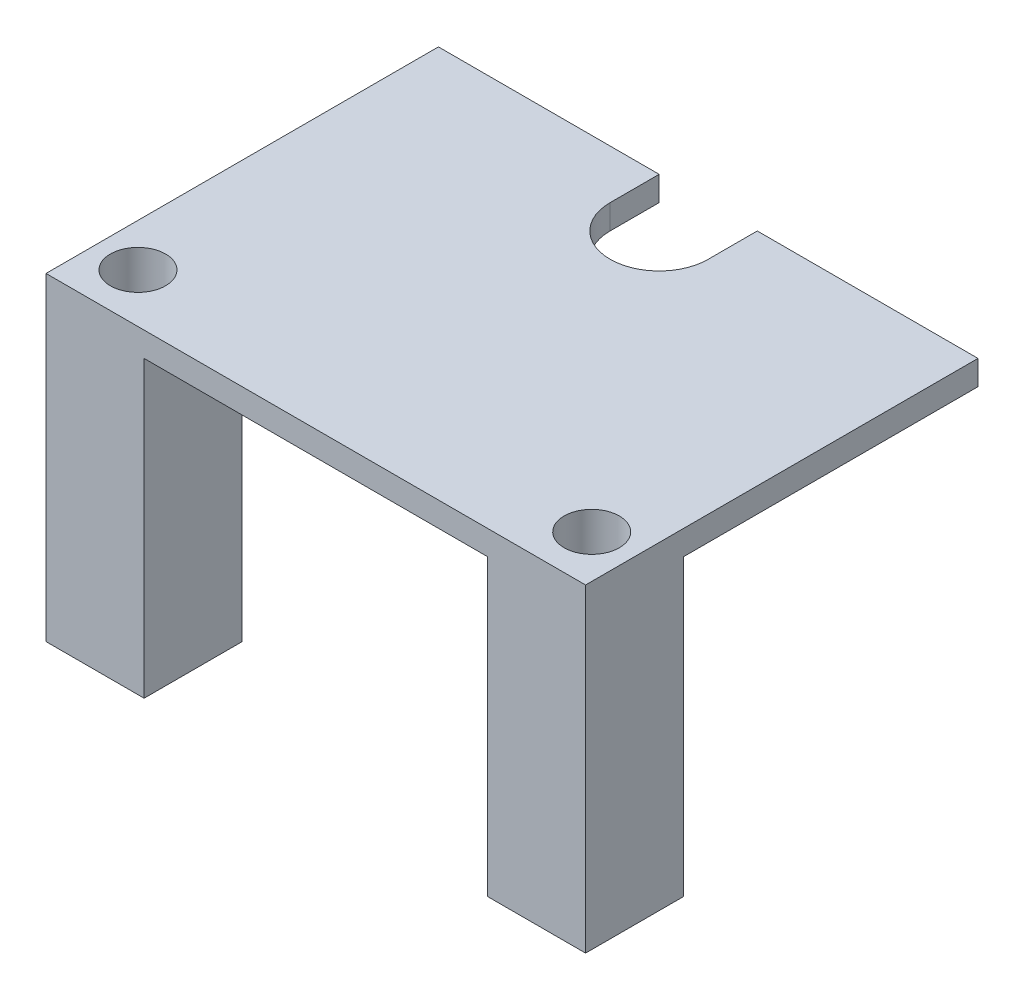
ISO-10303-21;
HEADER;
FILE_DESCRIPTION(('STEP AP214'),'2;1');
FILE_NAME('part.step','',(''),(''),'','','');
FILE_SCHEMA(('AUTOMOTIVE_DESIGN { 1 0 10303 214 1 1 1 1 }'));
ENDSEC;
DATA;
#1=APPLICATION_CONTEXT('core data for automotive mechanical design processes');
#2=APPLICATION_PROTOCOL_DEFINITION('international standard','automotive_design',2000,#1);
#3=PRODUCT_CONTEXT('',#1,'mechanical');
#4=PRODUCT('Part','Part','',(#3));
#5=PRODUCT_RELATED_PRODUCT_CATEGORY('part','',(#4));
#6=PRODUCT_DEFINITION_FORMATION('','',#4);
#7=PRODUCT_DEFINITION_CONTEXT('part definition',#1,'design');
#8=PRODUCT_DEFINITION('design','',#6,#7);
#9=PRODUCT_DEFINITION_SHAPE('','',#8);
#10=(LENGTH_UNIT() NAMED_UNIT(*) SI_UNIT(.MILLI.,.METRE.));
#11=(NAMED_UNIT(*) PLANE_ANGLE_UNIT() SI_UNIT($,.RADIAN.));
#12=(NAMED_UNIT(*) SI_UNIT($,.STERADIAN.) SOLID_ANGLE_UNIT());
#13=UNCERTAINTY_MEASURE_WITH_UNIT(LENGTH_MEASURE(1.E-05),#10,'distance_accuracy_value','');
#14=(GEOMETRIC_REPRESENTATION_CONTEXT(3) GLOBAL_UNCERTAINTY_ASSIGNED_CONTEXT((#13)) GLOBAL_UNIT_ASSIGNED_CONTEXT((#10,
#11,#12)) REPRESENTATION_CONTEXT('',''));
#15=CARTESIAN_POINT('',(0.,0.,0.));
#16=DIRECTION('',(0.,0.,1.));
#17=DIRECTION('',(1.,0.,0.));
#18=AXIS2_PLACEMENT_3D('',#15,#16,#17);
#19=CARTESIAN_POINT('',(69.85,76.2,-88.9));
#20=DIRECTION('',(0.,0.,1.));
#21=DIRECTION('',(1.,0.,0.));
#22=AXIS2_PLACEMENT_3D('',#19,#20,#21);
#23=PLANE('',#22);
#24=DIRECTION('',(-1.,0.,0.));
#25=VECTOR('',#24,1.);
#26=CARTESIAN_POINT('',(69.85,82.55,-88.9));
#27=LINE('',#26,#25);
#28=CARTESIAN_POINT('',(-12.7,82.55,-88.9));
#29=VERTEX_POINT('',#28);
#30=CARTESIAN_POINT('',(-69.85,82.55,-88.9));
#31=VERTEX_POINT('',#30);
#32=EDGE_CURVE('E259',#29,#31,#27,.T.);
#33=ORIENTED_EDGE('',*,*,#32,.F.);
#34=DIRECTION('',(0.,-1.,0.));
#35=VECTOR('',#34,1.);
#36=CARTESIAN_POINT('',(-12.7,76.2,-88.9));
#37=LINE('',#36,#35);
#38=CARTESIAN_POINT('',(-12.7,76.2,-88.9));
#39=VERTEX_POINT('',#38);
#40=EDGE_CURVE('E47',#29,#39,#37,.T.);
#41=ORIENTED_EDGE('',*,*,#40,.T.);
#42=DIRECTION('',(-1.,0.,0.));
#43=VECTOR('',#42,1.);
#44=CARTESIAN_POINT('',(69.85,76.2,-88.9));
#45=LINE('',#44,#43);
#46=CARTESIAN_POINT('',(-69.85,76.2,-88.9));
#47=VERTEX_POINT('',#46);
#48=EDGE_CURVE('E284',#39,#47,#45,.T.);
#49=ORIENTED_EDGE('',*,*,#48,.T.);
#50=DIRECTION('',(0.,1.,0.));
#51=VECTOR('',#50,1.);
#52=CARTESIAN_POINT('',(-69.85,76.2,-88.9));
#53=LINE('',#52,#51);
#54=EDGE_CURVE('E244',#47,#31,#53,.T.);
#55=ORIENTED_EDGE('',*,*,#54,.T.);
#56=EDGE_LOOP('',(#33,#41,#49,#55));
#57=FACE_BOUND('',#56,.T.);
#58=ADVANCED_FACE('F38',(#57),#23,.F.);
#59=CARTESIAN_POINT('',(69.85,0.,12.7));
#60=DIRECTION('',(0.,1.,0.));
#61=DIRECTION('',(0.,0.,1.));
#62=AXIS2_PLACEMENT_3D('',#59,#60,#61);
#63=PLANE('',#62);
#64=CARTESIAN_POINT('',(-58.7375,0.,0.));
#65=DIRECTION('',(0.,1.,0.));
#66=DIRECTION('',(0.,0.,1.));
#67=AXIS2_PLACEMENT_3D('',#64,#65,#66);
#68=CIRCLE('',#67,3.37819999999998);
#69=CARTESIAN_POINT('',(-58.7375,0.,3.37819999999998));
#70=VERTEX_POINT('',#69);
#71=EDGE_CURVE('E202',#70,#70,#68,.T.);
#72=ORIENTED_EDGE('',*,*,#71,.T.);
#73=EDGE_LOOP('',(#72));
#74=FACE_BOUND('',#73,.T.);
#75=DIRECTION('',(-1.,0.,0.));
#76=VECTOR('',#75,1.);
#77=CARTESIAN_POINT('',(69.85,0.,-12.7));
#78=LINE('',#77,#76);
#79=CARTESIAN_POINT('',(-44.45,0.,-12.7));
#80=VERTEX_POINT('',#79);
#81=CARTESIAN_POINT('',(-69.85,0.,-12.7));
#82=VERTEX_POINT('',#81);
#83=EDGE_CURVE('E294',#80,#82,#78,.T.);
#84=ORIENTED_EDGE('',*,*,#83,.F.);
#85=DIRECTION('',(0.,0.,-1.));
#86=VECTOR('',#85,1.);
#87=CARTESIAN_POINT('',(-44.45,0.,12.7));
#88=LINE('',#87,#86);
#89=CARTESIAN_POINT('',(-44.45,0.,12.7));
#90=VERTEX_POINT('',#89);
#91=EDGE_CURVE('E223',#90,#80,#88,.T.);
#92=ORIENTED_EDGE('',*,*,#91,.F.);
#93=DIRECTION('',(-1.,0.,0.));
#94=VECTOR('',#93,1.);
#95=CARTESIAN_POINT('',(69.85,0.,12.7));
#96=LINE('',#95,#94);
#97=CARTESIAN_POINT('',(-69.85,0.,12.7));
#98=VERTEX_POINT('',#97);
#99=EDGE_CURVE('E299',#90,#98,#96,.T.);
#100=ORIENTED_EDGE('',*,*,#99,.T.);
#101=DIRECTION('',(0.,0.,-1.));
#102=VECTOR('',#101,1.);
#103=CARTESIAN_POINT('',(-69.85,0.,12.7));
#104=LINE('',#103,#102);
#105=EDGE_CURVE('E267',#98,#82,#104,.T.);
#106=ORIENTED_EDGE('',*,*,#105,.T.);
#107=EDGE_LOOP('',(#84,#92,#100,#106));
#108=FACE_BOUND('',#107,.T.);
#109=ADVANCED_FACE('F351',(#74,#108),#63,.F.);
#110=CARTESIAN_POINT('',(69.85,0.,-12.7));
#111=DIRECTION('',(0.,0.,1.));
#112=DIRECTION('',(0.,-1.,0.));
#113=AXIS2_PLACEMENT_3D('',#110,#111,#112);
#114=PLANE('',#113);
#115=DIRECTION('',(-1.,0.,0.));
#116=VECTOR('',#115,1.);
#117=CARTESIAN_POINT('',(69.85,76.2,-12.7));
#118=LINE('',#117,#116);
#119=CARTESIAN_POINT('',(-44.45,76.2,-12.7));
#120=VERTEX_POINT('',#119);
#121=CARTESIAN_POINT('',(-69.85,76.2,-12.7));
#122=VERTEX_POINT('',#121);
#123=EDGE_CURVE('E289',#120,#122,#118,.T.);
#124=ORIENTED_EDGE('',*,*,#123,.F.);
#125=DIRECTION('',(0.,-1.,0.));
#126=VECTOR('',#125,1.);
#127=CARTESIAN_POINT('',(-44.45,0.,-12.7));
#128=LINE('',#127,#126);
#129=EDGE_CURVE('E234',#120,#80,#128,.T.);
#130=ORIENTED_EDGE('',*,*,#129,.T.);
#131=ORIENTED_EDGE('',*,*,#83,.T.);
#132=DIRECTION('',(0.,1.,0.));
#133=VECTOR('',#132,1.);
#134=CARTESIAN_POINT('',(-69.85,0.,-12.7));
#135=LINE('',#134,#133);
#136=EDGE_CURVE('E271',#82,#122,#135,.T.);
#137=ORIENTED_EDGE('',*,*,#136,.T.);
#138=EDGE_LOOP('',(#124,#130,#131,#137));
#139=FACE_BOUND('',#138,.T.);
#140=ADVANCED_FACE('F358',(#139),#114,.F.);
#141=CARTESIAN_POINT('',(69.85,82.55,-88.9));
#142=DIRECTION('',(0.,-1.,0.));
#143=DIRECTION('',(0.,0.,-1.));
#144=AXIS2_PLACEMENT_3D('',#141,#142,#143);
#145=PLANE('',#144);
#146=CARTESIAN_POINT('',(58.7375,82.55,0.));
#147=DIRECTION('',(0.,1.,0.));
#148=DIRECTION('',(0.,0.,1.));
#149=AXIS2_PLACEMENT_3D('',#146,#147,#148);
#150=CIRCLE('',#149,7.14374999999999);
#151=CARTESIAN_POINT('',(58.7375,82.55,7.14375000000001));
#152=VERTEX_POINT('',#151);
#153=EDGE_CURVE('E174',#152,#152,#150,.T.);
#154=ORIENTED_EDGE('',*,*,#153,.F.);
#155=EDGE_LOOP('',(#154));
#156=FACE_BOUND('',#155,.T.);
#157=CARTESIAN_POINT('',(-58.7375,82.55,0.));
#158=DIRECTION('',(0.,1.,0.));
#159=DIRECTION('',(0.,0.,1.));
#160=AXIS2_PLACEMENT_3D('',#157,#158,#159);
#161=CIRCLE('',#160,7.14374999999999);
#162=CARTESIAN_POINT('',(-58.7375,82.55,7.14375000000002));
#163=VERTEX_POINT('',#162);
#164=EDGE_CURVE('E190',#163,#163,#161,.T.);
#165=ORIENTED_EDGE('',*,*,#164,.F.);
#166=EDGE_LOOP('',(#165));
#167=FACE_BOUND('',#166,.T.);
#168=CARTESIAN_POINT('',(0.,82.55,-76.2));
#169=DIRECTION('',(0.,1.,0.));
#170=DIRECTION('',(0.,0.,-1.));
#171=AXIS2_PLACEMENT_3D('',#168,#169,#170);
#172=CIRCLE('',#171,12.7);
#173=CARTESIAN_POINT('',(-12.7,82.55,-76.2));
#174=VERTEX_POINT('',#173);
#175=CARTESIAN_POINT('',(12.7,82.55,-76.2));
#176=VERTEX_POINT('',#175);
#177=EDGE_CURVE('E149',#174,#176,#172,.T.);
#178=ORIENTED_EDGE('',*,*,#177,.F.);
#179=DIRECTION('',(0.,0.,1.));
#180=VECTOR('',#179,1.);
#181=CARTESIAN_POINT('',(-12.7,82.55,-76.2));
#182=LINE('',#181,#180);
#183=EDGE_CURVE('E146',#29,#174,#182,.T.);
#184=ORIENTED_EDGE('',*,*,#183,.F.);
#185=ORIENTED_EDGE('',*,*,#32,.T.);
#186=DIRECTION('',(0.,0.,1.));
#187=VECTOR('',#186,1.);
#188=CARTESIAN_POINT('',(-69.85,82.55,-88.9));
#189=LINE('',#188,#187);
#190=CARTESIAN_POINT('',(-69.85,82.55,12.7));
#191=VERTEX_POINT('',#190);
#192=EDGE_CURVE('E238',#31,#191,#189,.T.);
#193=ORIENTED_EDGE('',*,*,#192,.T.);
#194=DIRECTION('',(-1.,0.,0.));
#195=VECTOR('',#194,1.);
#196=CARTESIAN_POINT('',(69.85,82.55,12.7));
#197=LINE('',#196,#195);
#198=CARTESIAN_POINT('',(69.85,82.55,12.7));
#199=VERTEX_POINT('',#198);
#200=EDGE_CURVE('E304',#199,#191,#197,.T.);
#201=ORIENTED_EDGE('',*,*,#200,.F.);
#202=DIRECTION('',(0.,0.,1.));
#203=VECTOR('',#202,1.);
#204=CARTESIAN_POINT('',(69.85,82.55,-88.9));
#205=LINE('',#204,#203);
#206=CARTESIAN_POINT('',(69.85,82.55,-88.9));
#207=VERTEX_POINT('',#206);
#208=EDGE_CURVE('E239',#207,#199,#205,.T.);
#209=ORIENTED_EDGE('',*,*,#208,.F.);
#210=CARTESIAN_POINT('',(12.7,82.55,-88.9));
#211=VERTEX_POINT('',#210);
#212=EDGE_CURVE('E160',#207,#211,#27,.T.);
#213=ORIENTED_EDGE('',*,*,#212,.T.);
#214=DIRECTION('',(0.,0.,-1.));
#215=VECTOR('',#214,1.);
#216=CARTESIAN_POINT('',(12.7,82.55,-76.2));
#217=LINE('',#216,#215);
#218=EDGE_CURVE('E54',#176,#211,#217,.T.);
#219=ORIENTED_EDGE('',*,*,#218,.F.);
#220=EDGE_LOOP('',(#178,#184,#185,#193,#201,#209,#213,#219));
#221=FACE_BOUND('',#220,.T.);
#222=ADVANCED_FACE('F40',(#156,#167,#221),#145,.F.);
#223=CARTESIAN_POINT('',(69.85,82.55,12.7));
#224=DIRECTION('',(0.,0.,-1.));
#225=DIRECTION('',(0.,1.,0.));
#226=AXIS2_PLACEMENT_3D('',#223,#224,#225);
#227=PLANE('',#226);
#228=ORIENTED_EDGE('',*,*,#99,.F.);
#229=DIRECTION('',(0.,1.,0.));
#230=VECTOR('',#229,1.);
#231=CARTESIAN_POINT('',(-44.45,0.,12.7));
#232=LINE('',#231,#230);
#233=CARTESIAN_POINT('',(-44.45,76.2,12.7));
#234=VERTEX_POINT('',#233);
#235=EDGE_CURVE('E214',#90,#234,#232,.T.);
#236=ORIENTED_EDGE('',*,*,#235,.T.);
#237=DIRECTION('',(1.,0.,0.));
#238=VECTOR('',#237,1.);
#239=CARTESIAN_POINT('',(-44.45,76.2,12.7));
#240=LINE('',#239,#238);
#241=CARTESIAN_POINT('',(44.45,76.2,12.7));
#242=VERTEX_POINT('',#241);
#243=EDGE_CURVE('E206',#234,#242,#240,.T.);
#244=ORIENTED_EDGE('',*,*,#243,.T.);
#245=DIRECTION('',(0.,-1.,0.));
#246=VECTOR('',#245,1.);
#247=CARTESIAN_POINT('',(44.45,76.2,12.7));
#248=LINE('',#247,#246);
#249=CARTESIAN_POINT('',(44.45,0.,12.7));
#250=VERTEX_POINT('',#249);
#251=EDGE_CURVE('E210',#242,#250,#248,.T.);
#252=ORIENTED_EDGE('',*,*,#251,.T.);
#253=CARTESIAN_POINT('',(69.85,0.,12.7));
#254=VERTEX_POINT('',#253);
#255=EDGE_CURVE('E300',#254,#250,#96,.T.);
#256=ORIENTED_EDGE('',*,*,#255,.F.);
#257=DIRECTION('',(0.,-1.,0.));
#258=VECTOR('',#257,1.);
#259=CARTESIAN_POINT('',(69.85,82.55,12.7));
#260=LINE('',#259,#258);
#261=EDGE_CURVE('E243',#199,#254,#260,.T.);
#262=ORIENTED_EDGE('',*,*,#261,.F.);
#263=ORIENTED_EDGE('',*,*,#200,.T.);
#264=DIRECTION('',(0.,-1.,0.));
#265=VECTOR('',#264,1.);
#266=CARTESIAN_POINT('',(-69.85,82.55,12.7));
#267=LINE('',#266,#265);
#268=EDGE_CURVE('E263',#191,#98,#267,.T.);
#269=ORIENTED_EDGE('',*,*,#268,.T.);
#270=EDGE_LOOP('',(#228,#236,#244,#252,#256,#262,#263,#269));
#271=FACE_BOUND('',#270,.T.);
#272=ADVANCED_FACE('F331',(#271),#227,.F.);
#273=CARTESIAN_POINT('',(58.7375,0.,0.));
#274=DIRECTION('',(0.,1.,0.));
#275=DIRECTION('',(0.,0.,1.));
#276=AXIS2_PLACEMENT_3D('',#273,#274,#275);
#277=CIRCLE('',#276,3.37819999999998);
#278=CARTESIAN_POINT('',(58.7375,0.,3.37819999999998));
#279=VERTEX_POINT('',#278);
#280=EDGE_CURVE('E186',#279,#279,#277,.T.);
#281=ORIENTED_EDGE('',*,*,#280,.T.);
#282=EDGE_LOOP('',(#281));
#283=FACE_BOUND('',#282,.T.);
#284=ORIENTED_EDGE('',*,*,#255,.T.);
#285=DIRECTION('',(0.,0.,-1.));
#286=VECTOR('',#285,1.);
#287=CARTESIAN_POINT('',(44.45,0.,12.7));
#288=LINE('',#287,#286);
#289=CARTESIAN_POINT('',(44.45,0.,-12.7));
#290=VERTEX_POINT('',#289);
#291=EDGE_CURVE('E226',#250,#290,#288,.T.);
#292=ORIENTED_EDGE('',*,*,#291,.T.);
#293=CARTESIAN_POINT('',(69.85,0.,-12.7));
#294=VERTEX_POINT('',#293);
#295=EDGE_CURVE('E295',#294,#290,#78,.T.);
#296=ORIENTED_EDGE('',*,*,#295,.F.);
#297=DIRECTION('',(0.,0.,-1.));
#298=VECTOR('',#297,1.);
#299=CARTESIAN_POINT('',(69.85,0.,12.7));
#300=LINE('',#299,#298);
#301=EDGE_CURVE('E247',#254,#294,#300,.T.);
#302=ORIENTED_EDGE('',*,*,#301,.F.);
#303=EDGE_LOOP('',(#284,#292,#296,#302));
#304=FACE_BOUND('',#303,.T.);
#305=ADVANCED_FACE('F361',(#283,#304),#63,.F.);
#306=ORIENTED_EDGE('',*,*,#295,.T.);
#307=DIRECTION('',(0.,1.,0.));
#308=VECTOR('',#307,1.);
#309=CARTESIAN_POINT('',(44.45,0.,-12.7));
#310=LINE('',#309,#308);
#311=CARTESIAN_POINT('',(44.45,76.2,-12.7));
#312=VERTEX_POINT('',#311);
#313=EDGE_CURVE('E222',#290,#312,#310,.T.);
#314=ORIENTED_EDGE('',*,*,#313,.T.);
#315=CARTESIAN_POINT('',(69.85,76.2,-12.7));
#316=VERTEX_POINT('',#315);
#317=EDGE_CURVE('E290',#316,#312,#118,.T.);
#318=ORIENTED_EDGE('',*,*,#317,.F.);
#319=DIRECTION('',(0.,1.,0.));
#320=VECTOR('',#319,1.);
#321=CARTESIAN_POINT('',(69.85,0.,-12.7));
#322=LINE('',#321,#320);
#323=EDGE_CURVE('E250',#294,#316,#322,.T.);
#324=ORIENTED_EDGE('',*,*,#323,.F.);
#325=EDGE_LOOP('',(#306,#314,#318,#324));
#326=FACE_BOUND('',#325,.T.);
#327=ADVANCED_FACE('F371',(#326),#114,.F.);
#328=CARTESIAN_POINT('',(69.85,76.2,-12.7));
#329=DIRECTION('',(0.,1.,0.));
#330=DIRECTION('',(0.,0.,1.));
#331=AXIS2_PLACEMENT_3D('',#328,#329,#330);
#332=PLANE('',#331);
#333=ORIENTED_EDGE('',*,*,#48,.F.);
#334=DIRECTION('',(0.,0.,1.));
#335=VECTOR('',#334,1.);
#336=CARTESIAN_POINT('',(-12.7,76.2,-12.7));
#337=LINE('',#336,#335);
#338=CARTESIAN_POINT('',(-12.7,76.2,-76.2));
#339=VERTEX_POINT('',#338);
#340=EDGE_CURVE('E170',#39,#339,#337,.T.);
#341=ORIENTED_EDGE('',*,*,#340,.T.);
#342=CARTESIAN_POINT('',(0.,76.2,-76.2));
#343=DIRECTION('',(0.,1.,0.));
#344=DIRECTION('',(0.,0.,1.));
#345=AXIS2_PLACEMENT_3D('',#342,#343,#344);
#346=CIRCLE('',#345,12.7);
#347=CARTESIAN_POINT('',(12.7,76.2,-76.2));
#348=VERTEX_POINT('',#347);
#349=EDGE_CURVE('E11',#339,#348,#346,.T.);
#350=ORIENTED_EDGE('',*,*,#349,.T.);
#351=DIRECTION('',(0.,0.,-1.));
#352=VECTOR('',#351,1.);
#353=CARTESIAN_POINT('',(12.7,76.2,-12.7));
#354=LINE('',#353,#352);
#355=CARTESIAN_POINT('',(12.7,76.2,-88.9));
#356=VERTEX_POINT('',#355);
#357=EDGE_CURVE('E142',#348,#356,#354,.T.);
#358=ORIENTED_EDGE('',*,*,#357,.T.);
#359=CARTESIAN_POINT('',(69.85,76.2,-88.9));
#360=VERTEX_POINT('',#359);
#361=EDGE_CURVE('E285',#360,#356,#45,.T.);
#362=ORIENTED_EDGE('',*,*,#361,.F.);
#363=DIRECTION('',(0.,0.,-1.));
#364=VECTOR('',#363,1.);
#365=CARTESIAN_POINT('',(69.85,76.2,-12.7));
#366=LINE('',#365,#364);
#367=EDGE_CURVE('E253',#316,#360,#366,.T.);
#368=ORIENTED_EDGE('',*,*,#367,.F.);
#369=ORIENTED_EDGE('',*,*,#317,.T.);
#370=DIRECTION('',(0.,0.,-1.));
#371=VECTOR('',#370,1.);
#372=CARTESIAN_POINT('',(44.45,76.2,12.7));
#373=LINE('',#372,#371);
#374=EDGE_CURVE('E62',#242,#312,#373,.T.);
#375=ORIENTED_EDGE('',*,*,#374,.F.);
#376=ORIENTED_EDGE('',*,*,#243,.F.);
#377=DIRECTION('',(0.,0.,-1.));
#378=VECTOR('',#377,1.);
#379=CARTESIAN_POINT('',(-44.45,76.2,12.7));
#380=LINE('',#379,#378);
#381=EDGE_CURVE('E218',#234,#120,#380,.T.);
#382=ORIENTED_EDGE('',*,*,#381,.T.);
#383=ORIENTED_EDGE('',*,*,#123,.T.);
#384=DIRECTION('',(0.,0.,-1.));
#385=VECTOR('',#384,1.);
#386=CARTESIAN_POINT('',(-69.85,76.2,-12.7));
#387=LINE('',#386,#385);
#388=EDGE_CURVE('E275',#122,#47,#387,.T.);
#389=ORIENTED_EDGE('',*,*,#388,.T.);
#390=EDGE_LOOP('',(#333,#341,#350,#358,#362,#368,#369,#375,#376,#382,#383,#389));
#391=FACE_BOUND('',#390,.T.);
#392=ADVANCED_FACE('F317',(#391),#332,.F.);
#393=ORIENTED_EDGE('',*,*,#361,.T.);
#394=DIRECTION('',(0.,1.,0.));
#395=VECTOR('',#394,1.);
#396=CARTESIAN_POINT('',(12.7,76.2,-88.9));
#397=LINE('',#396,#395);
#398=EDGE_CURVE('E308',#356,#211,#397,.T.);
#399=ORIENTED_EDGE('',*,*,#398,.T.);
#400=ORIENTED_EDGE('',*,*,#212,.F.);
#401=DIRECTION('',(0.,1.,0.));
#402=VECTOR('',#401,1.);
#403=CARTESIAN_POINT('',(69.85,76.2,-88.9));
#404=LINE('',#403,#402);
#405=EDGE_CURVE('E256',#360,#207,#404,.T.);
#406=ORIENTED_EDGE('',*,*,#405,.F.);
#407=EDGE_LOOP('',(#393,#399,#400,#406));
#408=FACE_BOUND('',#407,.T.);
#409=ADVANCED_FACE('F339',(#408),#23,.F.);
#410=CARTESIAN_POINT('',(69.85,0.,0.));
#411=DIRECTION('',(1.,0.,0.));
#412=DIRECTION('',(0.,0.,-1.));
#413=AXIS2_PLACEMENT_3D('',#410,#411,#412);
#414=PLANE('',#413);
#415=ORIENTED_EDGE('',*,*,#208,.T.);
#416=ORIENTED_EDGE('',*,*,#261,.T.);
#417=ORIENTED_EDGE('',*,*,#301,.T.);
#418=ORIENTED_EDGE('',*,*,#323,.T.);
#419=ORIENTED_EDGE('',*,*,#367,.T.);
#420=ORIENTED_EDGE('',*,*,#405,.T.);
#421=EDGE_LOOP('',(#415,#416,#417,#418,#419,#420));
#422=FACE_BOUND('',#421,.T.);
#423=ADVANCED_FACE('F334',(#422),#414,.T.);
#424=CARTESIAN_POINT('',(-69.85,0.,0.));
#425=DIRECTION('',(1.,0.,0.));
#426=DIRECTION('',(0.,0.,-1.));
#427=AXIS2_PLACEMENT_3D('',#424,#425,#426);
#428=PLANE('',#427);
#429=ORIENTED_EDGE('',*,*,#192,.F.);
#430=ORIENTED_EDGE('',*,*,#54,.F.);
#431=ORIENTED_EDGE('',*,*,#388,.F.);
#432=ORIENTED_EDGE('',*,*,#136,.F.);
#433=ORIENTED_EDGE('',*,*,#105,.F.);
#434=ORIENTED_EDGE('',*,*,#268,.F.);
#435=EDGE_LOOP('',(#429,#430,#431,#432,#433,#434));
#436=FACE_BOUND('',#435,.T.);
#437=ADVANCED_FACE('F326',(#436),#428,.F.);
#438=CARTESIAN_POINT('',(-44.45,0.,12.7));
#439=DIRECTION('',(-1.,0.,0.));
#440=DIRECTION('',(0.,-1.,0.));
#441=AXIS2_PLACEMENT_3D('',#438,#439,#440);
#442=PLANE('',#441);
#443=ORIENTED_EDGE('',*,*,#381,.F.);
#444=ORIENTED_EDGE('',*,*,#235,.F.);
#445=ORIENTED_EDGE('',*,*,#91,.T.);
#446=ORIENTED_EDGE('',*,*,#129,.F.);
#447=EDGE_LOOP('',(#443,#444,#445,#446));
#448=FACE_BOUND('',#447,.T.);
#449=ADVANCED_FACE('F414',(#448),#442,.F.);
#450=CARTESIAN_POINT('',(44.45,76.2,12.7));
#451=DIRECTION('',(1.,0.,0.));
#452=DIRECTION('',(0.,0.,-1.));
#453=AXIS2_PLACEMENT_3D('',#450,#451,#452);
#454=PLANE('',#453);
#455=ORIENTED_EDGE('',*,*,#291,.F.);
#456=ORIENTED_EDGE('',*,*,#251,.F.);
#457=ORIENTED_EDGE('',*,*,#374,.T.);
#458=ORIENTED_EDGE('',*,*,#313,.F.);
#459=EDGE_LOOP('',(#455,#456,#457,#458));
#460=FACE_BOUND('',#459,.T.);
#461=ADVANCED_FACE('F412',(#460),#454,.F.);
#462=CARTESIAN_POINT('',(-58.7375,82.55,0.));
#463=DIRECTION('',(0.,1.,0.));
#464=DIRECTION('',(0.,0.,1.));
#465=AXIS2_PLACEMENT_3D('',#462,#463,#464);
#466=CYLINDRICAL_SURFACE('',#465,3.37819999999998);
#467=ORIENTED_EDGE('',*,*,#71,.F.);
#468=EDGE_LOOP('',(#467));
#469=FACE_BOUND('',#468,.T.);
#470=CARTESIAN_POINT('',(-58.7375,18.358993,0.));
#471=DIRECTION('',(0.,1.,0.));
#472=DIRECTION('',(0.,0.,1.));
#473=AXIS2_PLACEMENT_3D('',#470,#471,#472);
#474=CIRCLE('',#473,3.37819999999998);
#475=CARTESIAN_POINT('',(-58.7375,18.358993,3.3782));
#476=VERTEX_POINT('',#475);
#477=EDGE_CURVE('E198',#476,#476,#474,.T.);
#478=ORIENTED_EDGE('',*,*,#477,.T.);
#479=EDGE_LOOP('',(#478));
#480=FACE_BOUND('',#479,.T.);
#481=ADVANCED_FACE('F404',(#469,#480),#466,.F.);
#482=CARTESIAN_POINT('',(-55.3593,18.358993,0.));
#483=DIRECTION('',(0.,-1.,0.));
#484=DIRECTION('',(0.,0.,-1.));
#485=AXIS2_PLACEMENT_3D('',#482,#483,#484);
#486=PLANE('',#485);
#487=ORIENTED_EDGE('',*,*,#477,.F.);
#488=EDGE_LOOP('',(#487));
#489=FACE_BOUND('',#488,.T.);
#490=CARTESIAN_POINT('',(-58.7375,18.358993,0.));
#491=DIRECTION('',(0.,1.,0.));
#492=DIRECTION('',(0.,0.,1.));
#493=AXIS2_PLACEMENT_3D('',#490,#491,#492);
#494=CIRCLE('',#493,7.14374999999998);
#495=CARTESIAN_POINT('',(-58.7375,18.358993,7.14375));
#496=VERTEX_POINT('',#495);
#497=EDGE_CURVE('E194',#496,#496,#494,.T.);
#498=ORIENTED_EDGE('',*,*,#497,.T.);
#499=EDGE_LOOP('',(#498));
#500=FACE_BOUND('',#499,.T.);
#501=ADVANCED_FACE('F394',(#489,#500),#486,.F.);
#502=CARTESIAN_POINT('',(-58.7375,82.55,0.));
#503=DIRECTION('',(0.,1.,0.));
#504=DIRECTION('',(0.,0.,1.));
#505=AXIS2_PLACEMENT_3D('',#502,#503,#504);
#506=CYLINDRICAL_SURFACE('',#505,7.14374999999999);
#507=ORIENTED_EDGE('',*,*,#497,.F.);
#508=EDGE_LOOP('',(#507));
#509=FACE_BOUND('',#508,.T.);
#510=ORIENTED_EDGE('',*,*,#164,.T.);
#511=EDGE_LOOP('',(#510));
#512=FACE_BOUND('',#511,.T.);
#513=ADVANCED_FACE('F391',(#509,#512),#506,.F.);
#514=CARTESIAN_POINT('',(58.7375,82.55,0.));
#515=DIRECTION('',(0.,1.,0.));
#516=DIRECTION('',(0.,0.,1.));
#517=AXIS2_PLACEMENT_3D('',#514,#515,#516);
#518=CYLINDRICAL_SURFACE('',#517,3.37819999999998);
#519=ORIENTED_EDGE('',*,*,#280,.F.);
#520=EDGE_LOOP('',(#519));
#521=FACE_BOUND('',#520,.T.);
#522=CARTESIAN_POINT('',(58.7375,18.358993,0.));
#523=DIRECTION('',(0.,1.,0.));
#524=DIRECTION('',(0.,0.,1.));
#525=AXIS2_PLACEMENT_3D('',#522,#523,#524);
#526=CIRCLE('',#525,3.37819999999998);
#527=CARTESIAN_POINT('',(58.7375,18.358993,3.37819999999999));
#528=VERTEX_POINT('',#527);
#529=EDGE_CURVE('E182',#528,#528,#526,.T.);
#530=ORIENTED_EDGE('',*,*,#529,.T.);
#531=EDGE_LOOP('',(#530));
#532=FACE_BOUND('',#531,.T.);
#533=ADVANCED_FACE('F393',(#521,#532),#518,.F.);
#534=CARTESIAN_POINT('',(62.1157,18.358993,0.));
#535=DIRECTION('',(0.,-1.,0.));
#536=DIRECTION('',(0.,0.,-1.));
#537=AXIS2_PLACEMENT_3D('',#534,#535,#536);
#538=PLANE('',#537);
#539=ORIENTED_EDGE('',*,*,#529,.F.);
#540=EDGE_LOOP('',(#539));
#541=FACE_BOUND('',#540,.T.);
#542=CARTESIAN_POINT('',(58.7375,18.358993,0.));
#543=DIRECTION('',(0.,1.,0.));
#544=DIRECTION('',(0.,0.,1.));
#545=AXIS2_PLACEMENT_3D('',#542,#543,#544);
#546=CIRCLE('',#545,7.14374999999999);
#547=CARTESIAN_POINT('',(58.7375,18.358993,7.14375));
#548=VERTEX_POINT('',#547);
#549=EDGE_CURVE('E178',#548,#548,#546,.T.);
#550=ORIENTED_EDGE('',*,*,#549,.T.);
#551=EDGE_LOOP('',(#550));
#552=FACE_BOUND('',#551,.T.);
#553=ADVANCED_FACE('F401',(#541,#552),#538,.F.);
#554=CARTESIAN_POINT('',(58.7375,82.55,0.));
#555=DIRECTION('',(0.,1.,0.));
#556=DIRECTION('',(0.,0.,1.));
#557=AXIS2_PLACEMENT_3D('',#554,#555,#556);
#558=CYLINDRICAL_SURFACE('',#557,7.14374999999999);
#559=ORIENTED_EDGE('',*,*,#549,.F.);
#560=EDGE_LOOP('',(#559));
#561=FACE_BOUND('',#560,.T.);
#562=ORIENTED_EDGE('',*,*,#153,.T.);
#563=EDGE_LOOP('',(#562));
#564=FACE_BOUND('',#563,.T.);
#565=ADVANCED_FACE('F348',(#561,#564),#558,.F.);
#566=CARTESIAN_POINT('',(0.,0.,-76.2));
#567=DIRECTION('',(0.,1.,0.));
#568=DIRECTION('',(0.,0.,1.));
#569=AXIS2_PLACEMENT_3D('',#566,#567,#568);
#570=CYLINDRICAL_SURFACE('',#569,12.7);
#571=DIRECTION('',(0.,1.,0.));
#572=VECTOR('',#571,1.);
#573=CARTESIAN_POINT('',(-12.7,0.,-76.2));
#574=LINE('',#573,#572);
#575=EDGE_CURVE('E145',#339,#174,#574,.T.);
#576=ORIENTED_EDGE('',*,*,#575,.T.);
#577=ORIENTED_EDGE('',*,*,#177,.T.);
#578=DIRECTION('',(0.,1.,0.));
#579=VECTOR('',#578,1.);
#580=CARTESIAN_POINT('',(12.7,0.,-76.2));
#581=LINE('',#580,#579);
#582=EDGE_CURVE('E138',#348,#176,#581,.T.);
#583=ORIENTED_EDGE('',*,*,#582,.F.);
#584=ORIENTED_EDGE('',*,*,#349,.F.);
#585=EDGE_LOOP('',(#576,#577,#583,#584));
#586=FACE_BOUND('',#585,.T.);
#587=ADVANCED_FACE('F150',(#586),#570,.F.);
#588=CARTESIAN_POINT('',(-12.7,0.,-76.2));
#589=DIRECTION('',(-1.,0.,0.));
#590=DIRECTION('',(0.,0.,1.));
#591=AXIS2_PLACEMENT_3D('',#588,#589,#590);
#592=PLANE('',#591);
#593=ORIENTED_EDGE('',*,*,#40,.F.);
#594=ORIENTED_EDGE('',*,*,#183,.T.);
#595=ORIENTED_EDGE('',*,*,#575,.F.);
#596=ORIENTED_EDGE('',*,*,#340,.F.);
#597=EDGE_LOOP('',(#593,#594,#595,#596));
#598=FACE_BOUND('',#597,.T.);
#599=ADVANCED_FACE('F340',(#598),#592,.F.);
#600=CARTESIAN_POINT('',(12.7,0.,-76.2));
#601=DIRECTION('',(1.,0.,0.));
#602=DIRECTION('',(0.,0.,-1.));
#603=AXIS2_PLACEMENT_3D('',#600,#601,#602);
#604=PLANE('',#603);
#605=ORIENTED_EDGE('',*,*,#582,.T.);
#606=ORIENTED_EDGE('',*,*,#218,.T.);
#607=ORIENTED_EDGE('',*,*,#398,.F.);
#608=ORIENTED_EDGE('',*,*,#357,.F.);
#609=EDGE_LOOP('',(#605,#606,#607,#608));
#610=FACE_BOUND('',#609,.T.);
#611=ADVANCED_FACE('F140',(#610),#604,.F.);
#612=CLOSED_SHELL('',(#58,#109,#140,#222,#272,#305,#327,#392,#409,#423,#437,#449,#461,#481,#501,
#513,#533,#553,#565,#587,#599,#611));
#613=MANIFOLD_SOLID_BREP('B2',#612);
#614=ADVANCED_BREP_SHAPE_REPRESENTATION('',(#18,#613),#14);
#615=SHAPE_DEFINITION_REPRESENTATION(#9,#614);
ENDSEC;
END-ISO-10303-21;
